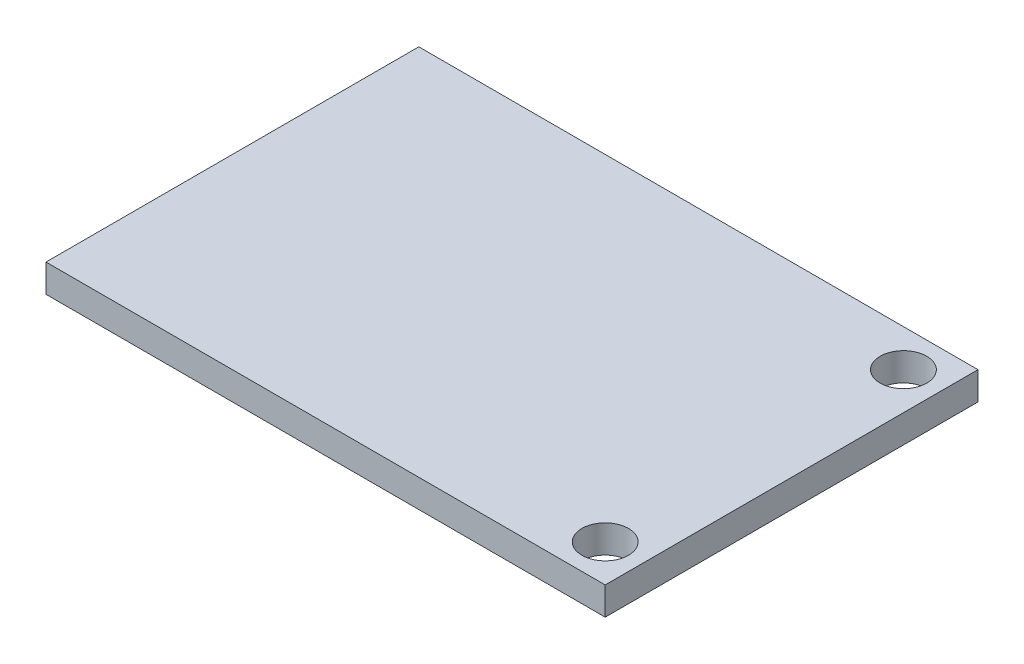
ISO-10303-21;
HEADER;
FILE_DESCRIPTION(('STEP AP214'),'2;1');
FILE_NAME('part.step','',(''),(''),'','','');
FILE_SCHEMA(('AUTOMOTIVE_DESIGN { 1 0 10303 214 1 1 1 1 }'));
ENDSEC;
DATA;
#1=APPLICATION_CONTEXT('core data for automotive mechanical design processes');
#2=APPLICATION_PROTOCOL_DEFINITION('international standard','automotive_design',2000,#1);
#3=PRODUCT_CONTEXT('',#1,'mechanical');
#4=PRODUCT('Part','Part','',(#3));
#5=PRODUCT_RELATED_PRODUCT_CATEGORY('part','',(#4));
#6=PRODUCT_DEFINITION_FORMATION('','',#4);
#7=PRODUCT_DEFINITION_CONTEXT('part definition',#1,'design');
#8=PRODUCT_DEFINITION('design','',#6,#7);
#9=PRODUCT_DEFINITION_SHAPE('','',#8);
#10=(LENGTH_UNIT() NAMED_UNIT(*) SI_UNIT(.MILLI.,.METRE.));
#11=(NAMED_UNIT(*) PLANE_ANGLE_UNIT() SI_UNIT($,.RADIAN.));
#12=(NAMED_UNIT(*) SI_UNIT($,.STERADIAN.) SOLID_ANGLE_UNIT());
#13=UNCERTAINTY_MEASURE_WITH_UNIT(LENGTH_MEASURE(1.E-05),#10,'distance_accuracy_value','');
#14=(GEOMETRIC_REPRESENTATION_CONTEXT(3) GLOBAL_UNCERTAINTY_ASSIGNED_CONTEXT((#13)) GLOBAL_UNIT_ASSIGNED_CONTEXT((#10,
#11,#12)) REPRESENTATION_CONTEXT('',''));
#15=CARTESIAN_POINT('',(0.,0.,0.));
#16=DIRECTION('',(0.,0.,1.));
#17=DIRECTION('',(1.,0.,0.));
#18=AXIS2_PLACEMENT_3D('',#15,#16,#17);
#19=CARTESIAN_POINT('',(-15.,1.5,10.));
#20=DIRECTION('',(0.,0.,-1.));
#21=DIRECTION('',(-1.,0.,0.));
#22=AXIS2_PLACEMENT_3D('',#19,#20,#21);
#23=PLANE('',#22);
#24=DIRECTION('',(1.,0.,0.));
#25=VECTOR('',#24,1.);
#26=CARTESIAN_POINT('',(-15.,0.,10.));
#27=LINE('',#26,#25);
#28=CARTESIAN_POINT('',(-15.,0.,10.));
#29=VERTEX_POINT('',#28);
#30=CARTESIAN_POINT('',(15.,0.,10.));
#31=VERTEX_POINT('',#30);
#32=EDGE_CURVE('E107',#29,#31,#27,.T.);
#33=ORIENTED_EDGE('',*,*,#32,.T.);
#34=DIRECTION('',(0.,-1.,0.));
#35=VECTOR('',#34,1.);
#36=CARTESIAN_POINT('',(15.,1.5,10.));
#37=LINE('',#36,#35);
#38=CARTESIAN_POINT('',(15.,1.5,10.));
#39=VERTEX_POINT('',#38);
#40=EDGE_CURVE('E11',#39,#31,#37,.T.);
#41=ORIENTED_EDGE('',*,*,#40,.F.);
#42=DIRECTION('',(1.,0.,0.));
#43=VECTOR('',#42,1.);
#44=CARTESIAN_POINT('',(-15.,1.5,10.));
#45=LINE('',#44,#43);
#46=CARTESIAN_POINT('',(-15.,1.5,10.));
#47=VERTEX_POINT('',#46);
#48=EDGE_CURVE('E89',#47,#39,#45,.T.);
#49=ORIENTED_EDGE('',*,*,#48,.F.);
#50=DIRECTION('',(0.,-1.,0.));
#51=VECTOR('',#50,1.);
#52=CARTESIAN_POINT('',(-15.,1.5,10.));
#53=LINE('',#52,#51);
#54=EDGE_CURVE('E56',#47,#29,#53,.T.);
#55=ORIENTED_EDGE('',*,*,#54,.T.);
#56=EDGE_LOOP('',(#33,#41,#49,#55));
#57=FACE_BOUND('',#56,.T.);
#58=ADVANCED_FACE('F39',(#57),#23,.F.);
#59=CARTESIAN_POINT('',(15.,1.5,10.));
#60=DIRECTION('',(-1.,0.,0.));
#61=DIRECTION('',(0.,0.,1.));
#62=AXIS2_PLACEMENT_3D('',#59,#60,#61);
#63=PLANE('',#62);
#64=DIRECTION('',(0.,0.,-1.));
#65=VECTOR('',#64,1.);
#66=CARTESIAN_POINT('',(15.,0.,10.));
#67=LINE('',#66,#65);
#68=CARTESIAN_POINT('',(15.,0.,-10.));
#69=VERTEX_POINT('',#68);
#70=EDGE_CURVE('E95',#31,#69,#67,.T.);
#71=ORIENTED_EDGE('',*,*,#70,.T.);
#72=DIRECTION('',(0.,-1.,0.));
#73=VECTOR('',#72,1.);
#74=CARTESIAN_POINT('',(15.,1.5,-10.));
#75=LINE('',#74,#73);
#76=CARTESIAN_POINT('',(15.,1.5,-10.));
#77=VERTEX_POINT('',#76);
#78=EDGE_CURVE('E48',#77,#69,#75,.T.);
#79=ORIENTED_EDGE('',*,*,#78,.F.);
#80=DIRECTION('',(0.,0.,-1.));
#81=VECTOR('',#80,1.);
#82=CARTESIAN_POINT('',(15.,1.5,10.));
#83=LINE('',#82,#81);
#84=EDGE_CURVE('E81',#39,#77,#83,.T.);
#85=ORIENTED_EDGE('',*,*,#84,.F.);
#86=ORIENTED_EDGE('',*,*,#40,.T.);
#87=EDGE_LOOP('',(#71,#79,#85,#86));
#88=FACE_BOUND('',#87,.T.);
#89=ADVANCED_FACE('F94',(#88),#63,.F.);
#90=CARTESIAN_POINT('',(-15.,1.5,-10.));
#91=DIRECTION('',(0.,0.,-1.));
#92=DIRECTION('',(-1.,0.,0.));
#93=AXIS2_PLACEMENT_3D('',#90,#91,#92);
#94=PLANE('',#93);
#95=DIRECTION('',(1.,0.,0.));
#96=VECTOR('',#95,1.);
#97=CARTESIAN_POINT('',(-15.,0.,-10.));
#98=LINE('',#97,#96);
#99=CARTESIAN_POINT('',(-15.,0.,-10.));
#100=VERTEX_POINT('',#99);
#101=EDGE_CURVE('E113',#100,#69,#98,.T.);
#102=ORIENTED_EDGE('',*,*,#101,.F.);
#103=DIRECTION('',(0.,-1.,0.));
#104=VECTOR('',#103,1.);
#105=CARTESIAN_POINT('',(-15.,1.5,-10.));
#106=LINE('',#105,#104);
#107=CARTESIAN_POINT('',(-15.,1.5,-10.));
#108=VERTEX_POINT('',#107);
#109=EDGE_CURVE('E70',#108,#100,#106,.T.);
#110=ORIENTED_EDGE('',*,*,#109,.F.);
#111=DIRECTION('',(1.,0.,0.));
#112=VECTOR('',#111,1.);
#113=CARTESIAN_POINT('',(-15.,1.5,-10.));
#114=LINE('',#113,#112);
#115=EDGE_CURVE('E88',#108,#77,#114,.T.);
#116=ORIENTED_EDGE('',*,*,#115,.T.);
#117=ORIENTED_EDGE('',*,*,#78,.T.);
#118=EDGE_LOOP('',(#102,#110,#116,#117));
#119=FACE_BOUND('',#118,.T.);
#120=ADVANCED_FACE('F99',(#119),#94,.T.);
#121=CARTESIAN_POINT('',(-15.,1.5,10.));
#122=DIRECTION('',(-1.,0.,0.));
#123=DIRECTION('',(0.,0.,1.));
#124=AXIS2_PLACEMENT_3D('',#121,#122,#123);
#125=PLANE('',#124);
#126=DIRECTION('',(0.,0.,-1.));
#127=VECTOR('',#126,1.);
#128=CARTESIAN_POINT('',(-15.,0.,10.));
#129=LINE('',#128,#127);
#130=EDGE_CURVE('E116',#29,#100,#129,.T.);
#131=ORIENTED_EDGE('',*,*,#130,.F.);
#132=ORIENTED_EDGE('',*,*,#54,.F.);
#133=DIRECTION('',(0.,0.,-1.));
#134=VECTOR('',#133,1.);
#135=CARTESIAN_POINT('',(-15.,1.5,10.));
#136=LINE('',#135,#134);
#137=EDGE_CURVE('E101',#47,#108,#136,.T.);
#138=ORIENTED_EDGE('',*,*,#137,.T.);
#139=ORIENTED_EDGE('',*,*,#109,.T.);
#140=EDGE_LOOP('',(#131,#132,#138,#139));
#141=FACE_BOUND('',#140,.T.);
#142=ADVANCED_FACE('F154',(#141),#125,.T.);
#143=CARTESIAN_POINT('',(0.,1.5,0.));
#144=DIRECTION('',(0.,1.,0.));
#145=DIRECTION('',(0.,0.,1.));
#146=AXIS2_PLACEMENT_3D('',#143,#144,#145);
#147=PLANE('',#146);
#148=CARTESIAN_POINT('',(13.,1.5,-8.));
#149=DIRECTION('',(0.,1.,0.));
#150=DIRECTION('',(0.,0.,1.));
#151=AXIS2_PLACEMENT_3D('',#148,#149,#150);
#152=CIRCLE('',#151,1.25);
#153=CARTESIAN_POINT('',(13.,1.5,-6.75));
#154=VERTEX_POINT('',#153);
#155=EDGE_CURVE('E134',#154,#154,#152,.T.);
#156=ORIENTED_EDGE('',*,*,#155,.F.);
#157=EDGE_LOOP('',(#156));
#158=FACE_BOUND('',#157,.T.);
#159=CARTESIAN_POINT('',(13.,1.5,8.));
#160=DIRECTION('',(0.,1.,0.));
#161=DIRECTION('',(0.,0.,1.));
#162=AXIS2_PLACEMENT_3D('',#159,#160,#161);
#163=CIRCLE('',#162,1.25);
#164=CARTESIAN_POINT('',(13.,1.5,9.25));
#165=VERTEX_POINT('',#164);
#166=EDGE_CURVE('E126',#165,#165,#163,.T.);
#167=ORIENTED_EDGE('',*,*,#166,.F.);
#168=EDGE_LOOP('',(#167));
#169=FACE_BOUND('',#168,.T.);
#170=ORIENTED_EDGE('',*,*,#48,.T.);
#171=ORIENTED_EDGE('',*,*,#84,.T.);
#172=ORIENTED_EDGE('',*,*,#115,.F.);
#173=ORIENTED_EDGE('',*,*,#137,.F.);
#174=EDGE_LOOP('',(#170,#171,#172,#173));
#175=FACE_BOUND('',#174,.T.);
#176=ADVANCED_FACE('F85',(#158,#169,#175),#147,.T.);
#177=CARTESIAN_POINT('',(0.,0.,0.));
#178=DIRECTION('',(0.,1.,0.));
#179=DIRECTION('',(0.,0.,1.));
#180=AXIS2_PLACEMENT_3D('',#177,#178,#179);
#181=PLANE('',#180);
#182=CARTESIAN_POINT('',(13.,0.,-8.));
#183=DIRECTION('',(0.,1.,0.));
#184=DIRECTION('',(0.,0.,1.));
#185=AXIS2_PLACEMENT_3D('',#182,#183,#184);
#186=CIRCLE('',#185,1.25);
#187=CARTESIAN_POINT('',(13.,0.,-6.75));
#188=VERTEX_POINT('',#187);
#189=EDGE_CURVE('E110',#188,#188,#186,.T.);
#190=ORIENTED_EDGE('',*,*,#189,.T.);
#191=EDGE_LOOP('',(#190));
#192=FACE_BOUND('',#191,.T.);
#193=CARTESIAN_POINT('',(13.,0.,8.));
#194=DIRECTION('',(0.,1.,0.));
#195=DIRECTION('',(0.,0.,1.));
#196=AXIS2_PLACEMENT_3D('',#193,#194,#195);
#197=CIRCLE('',#196,1.25);
#198=CARTESIAN_POINT('',(13.,0.,9.25));
#199=VERTEX_POINT('',#198);
#200=EDGE_CURVE('E130',#199,#199,#197,.T.);
#201=ORIENTED_EDGE('',*,*,#200,.T.);
#202=EDGE_LOOP('',(#201));
#203=FACE_BOUND('',#202,.T.);
#204=ORIENTED_EDGE('',*,*,#32,.F.);
#205=ORIENTED_EDGE('',*,*,#130,.T.);
#206=ORIENTED_EDGE('',*,*,#101,.T.);
#207=ORIENTED_EDGE('',*,*,#70,.F.);
#208=EDGE_LOOP('',(#204,#205,#206,#207));
#209=FACE_BOUND('',#208,.T.);
#210=ADVANCED_FACE('F142',(#192,#203,#209),#181,.F.);
#211=CARTESIAN_POINT('',(13.,0.,8.));
#212=DIRECTION('',(0.,1.,0.));
#213=DIRECTION('',(0.,0.,1.));
#214=AXIS2_PLACEMENT_3D('',#211,#212,#213);
#215=CYLINDRICAL_SURFACE('',#214,1.25);
#216=ORIENTED_EDGE('',*,*,#200,.F.);
#217=EDGE_LOOP('',(#216));
#218=FACE_BOUND('',#217,.T.);
#219=ORIENTED_EDGE('',*,*,#166,.T.);
#220=EDGE_LOOP('',(#219));
#221=FACE_BOUND('',#220,.T.);
#222=ADVANCED_FACE('F148',(#218,#221),#215,.F.);
#223=CARTESIAN_POINT('',(13.,0.,-8.));
#224=DIRECTION('',(0.,1.,0.));
#225=DIRECTION('',(0.,0.,1.));
#226=AXIS2_PLACEMENT_3D('',#223,#224,#225);
#227=CYLINDRICAL_SURFACE('',#226,1.25);
#228=ORIENTED_EDGE('',*,*,#189,.F.);
#229=EDGE_LOOP('',(#228));
#230=FACE_BOUND('',#229,.T.);
#231=ORIENTED_EDGE('',*,*,#155,.T.);
#232=EDGE_LOOP('',(#231));
#233=FACE_BOUND('',#232,.T.);
#234=ADVANCED_FACE('F145',(#230,#233),#227,.F.);
#235=CLOSED_SHELL('',(#58,#89,#120,#142,#176,#210,#222,#234));
#236=MANIFOLD_SOLID_BREP('B2',#235);
#237=ADVANCED_BREP_SHAPE_REPRESENTATION('',(#18,#236),#14);
#238=SHAPE_DEFINITION_REPRESENTATION(#9,#237);
ENDSEC;
END-ISO-10303-21;
